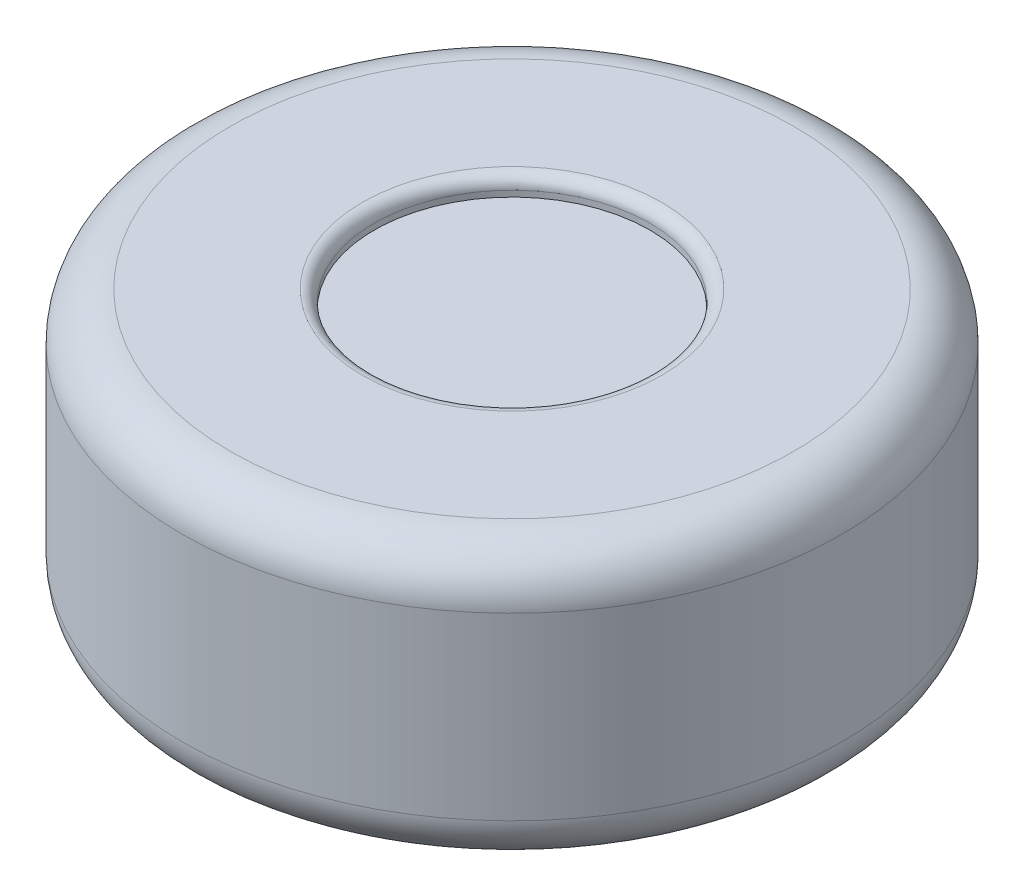
ISO-10303-21;
HEADER;
FILE_DESCRIPTION(('STEP AP214'),'2;1');
FILE_NAME('part.step','',(''),(''),'','','');
FILE_SCHEMA(('AUTOMOTIVE_DESIGN { 1 0 10303 214 1 1 1 1 }'));
ENDSEC;
DATA;
#1=APPLICATION_CONTEXT('core data for automotive mechanical design processes');
#2=APPLICATION_PROTOCOL_DEFINITION('international standard','automotive_design',2000,#1);
#3=PRODUCT_CONTEXT('',#1,'mechanical');
#4=PRODUCT('Part','Part','',(#3));
#5=PRODUCT_RELATED_PRODUCT_CATEGORY('part','',(#4));
#6=PRODUCT_DEFINITION_FORMATION('','',#4);
#7=PRODUCT_DEFINITION_CONTEXT('part definition',#1,'design');
#8=PRODUCT_DEFINITION('design','',#6,#7);
#9=PRODUCT_DEFINITION_SHAPE('','',#8);
#10=(LENGTH_UNIT() NAMED_UNIT(*) SI_UNIT(.MILLI.,.METRE.));
#11=(NAMED_UNIT(*) PLANE_ANGLE_UNIT() SI_UNIT($,.RADIAN.));
#12=(NAMED_UNIT(*) SI_UNIT($,.STERADIAN.) SOLID_ANGLE_UNIT());
#13=UNCERTAINTY_MEASURE_WITH_UNIT(LENGTH_MEASURE(1.E-05),#10,'distance_accuracy_value','');
#14=(GEOMETRIC_REPRESENTATION_CONTEXT(3) GLOBAL_UNCERTAINTY_ASSIGNED_CONTEXT((#13)) GLOBAL_UNIT_ASSIGNED_CONTEXT((#10,
#11,#12)) REPRESENTATION_CONTEXT('',''));
#15=CARTESIAN_POINT('',(0.,0.,0.));
#16=DIRECTION('',(0.,0.,1.));
#17=DIRECTION('',(1.,0.,0.));
#18=AXIS2_PLACEMENT_3D('',#15,#16,#17);
#19=CARTESIAN_POINT('',(0.,-115.,0.));
#20=DIRECTION('',(0.,1.,0.));
#21=DIRECTION('',(0.,0.,1.));
#22=AXIS2_PLACEMENT_3D('',#19,#20,#21);
#23=CYLINDRICAL_SURFACE('',#22,115.);
#24=CARTESIAN_POINT('',(0.,-105.,0.));
#25=DIRECTION('',(0.,1.,0.));
#26=DIRECTION('',(0.,0.,1.));
#27=AXIS2_PLACEMENT_3D('',#24,#25,#26);
#28=CIRCLE('',#27,115.);
#29=CARTESIAN_POINT('',(0.,-105.,115.));
#30=VERTEX_POINT('',#29);
#31=EDGE_CURVE('E42',#30,#30,#28,.F.);
#32=ORIENTED_EDGE('',*,*,#31,.T.);
#33=EDGE_LOOP('',(#32));
#34=FACE_BOUND('',#33,.T.);
#35=CARTESIAN_POINT('',(0.,-100.,0.));
#36=DIRECTION('',(0.,1.,0.));
#37=DIRECTION('',(0.,0.,1.));
#38=AXIS2_PLACEMENT_3D('',#35,#36,#37);
#39=CIRCLE('',#38,115.);
#40=CARTESIAN_POINT('',(0.,-100.,115.));
#41=VERTEX_POINT('',#40);
#42=EDGE_CURVE('E63',#41,#41,#39,.T.);
#43=ORIENTED_EDGE('',*,*,#42,.T.);
#44=EDGE_LOOP('',(#43));
#45=FACE_BOUND('',#44,.T.);
#46=ADVANCED_FACE('F31',(#34,#45),#23,.F.);
#47=CARTESIAN_POINT('',(0.,-115.,0.));
#48=DIRECTION('',(0.,1.,0.));
#49=DIRECTION('',(0.,0.,1.));
#50=AXIS2_PLACEMENT_3D('',#47,#48,#49);
#51=CYLINDRICAL_SURFACE('',#50,275.);
#52=CARTESIAN_POINT('',(0.,75.,0.));
#53=DIRECTION('',(0.,1.,0.));
#54=DIRECTION('',(0.,0.,1.));
#55=AXIS2_PLACEMENT_3D('',#52,#53,#54);
#56=CIRCLE('',#55,275.);
#57=CARTESIAN_POINT('',(0.,75.,275.));
#58=VERTEX_POINT('',#57);
#59=EDGE_CURVE('E54',#58,#58,#56,.F.);
#60=ORIENTED_EDGE('',*,*,#59,.T.);
#61=EDGE_LOOP('',(#60));
#62=FACE_BOUND('',#61,.T.);
#63=CARTESIAN_POINT('',(0.,-75.,0.));
#64=DIRECTION('',(0.,1.,0.));
#65=DIRECTION('',(0.,0.,1.));
#66=AXIS2_PLACEMENT_3D('',#63,#64,#65);
#67=CIRCLE('',#66,275.);
#68=CARTESIAN_POINT('',(0.,-75.,275.));
#69=VERTEX_POINT('',#68);
#70=EDGE_CURVE('E57',#69,#69,#67,.T.);
#71=ORIENTED_EDGE('',*,*,#70,.T.);
#72=EDGE_LOOP('',(#71));
#73=FACE_BOUND('',#72,.T.);
#74=ADVANCED_FACE('F87',(#62,#73),#51,.T.);
#75=CARTESIAN_POINT('',(0.,-115.,0.));
#76=DIRECTION('',(0.,1.,0.));
#77=DIRECTION('',(0.,0.,1.));
#78=AXIS2_PLACEMENT_3D('',#75,#76,#77);
#79=PLANE('',#78);
#80=CARTESIAN_POINT('',(0.,-115.,0.));
#81=DIRECTION('',(0.,1.,0.));
#82=DIRECTION('',(0.,0.,1.));
#83=AXIS2_PLACEMENT_3D('',#80,#81,#82);
#84=CIRCLE('',#83,125.);
#85=CARTESIAN_POINT('',(0.,-115.,125.));
#86=VERTEX_POINT('',#85);
#87=EDGE_CURVE('E46',#86,#86,#84,.T.);
#88=ORIENTED_EDGE('',*,*,#87,.T.);
#89=EDGE_LOOP('',(#88));
#90=FACE_BOUND('',#89,.T.);
#91=CARTESIAN_POINT('',(0.,-115.,0.));
#92=DIRECTION('',(0.,1.,0.));
#93=DIRECTION('',(0.,0.,1.));
#94=AXIS2_PLACEMENT_3D('',#91,#92,#93);
#95=CIRCLE('',#94,235.);
#96=CARTESIAN_POINT('',(0.,-115.,235.));
#97=VERTEX_POINT('',#96);
#98=EDGE_CURVE('E51',#97,#97,#95,.F.);
#99=ORIENTED_EDGE('',*,*,#98,.T.);
#100=EDGE_LOOP('',(#99));
#101=FACE_BOUND('',#100,.T.);
#102=ADVANCED_FACE('F94',(#90,#101),#79,.F.);
#103=CARTESIAN_POINT('',(0.,105.,0.));
#104=DIRECTION('',(0.,1.,0.));
#105=DIRECTION('',(0.,0.,1.));
#106=AXIS2_PLACEMENT_3D('',#103,#104,#105);
#107=CIRCLE('',#106,115.);
#108=CARTESIAN_POINT('',(0.,105.,115.));
#109=VERTEX_POINT('',#108);
#110=EDGE_CURVE('E38',#109,#109,#107,.T.);
#111=ORIENTED_EDGE('',*,*,#110,.T.);
#112=EDGE_LOOP('',(#111));
#113=FACE_BOUND('',#112,.T.);
#114=CARTESIAN_POINT('',(0.,100.,0.));
#115=DIRECTION('',(0.,1.,0.));
#116=DIRECTION('',(0.,0.,1.));
#117=AXIS2_PLACEMENT_3D('',#114,#115,#116);
#118=CIRCLE('',#117,115.);
#119=CARTESIAN_POINT('',(0.,100.,115.));
#120=VERTEX_POINT('',#119);
#121=EDGE_CURVE('E64',#120,#120,#118,.T.);
#122=ORIENTED_EDGE('',*,*,#121,.F.);
#123=EDGE_LOOP('',(#122));
#124=FACE_BOUND('',#123,.T.);
#125=ADVANCED_FACE('F90',(#113,#124),#23,.F.);
#126=CARTESIAN_POINT('',(0.,115.,0.));
#127=DIRECTION('',(0.,1.,0.));
#128=DIRECTION('',(0.,0.,1.));
#129=AXIS2_PLACEMENT_3D('',#126,#127,#128);
#130=PLANE('',#129);
#131=CARTESIAN_POINT('',(0.,115.,0.));
#132=DIRECTION('',(0.,1.,0.));
#133=DIRECTION('',(0.,0.,1.));
#134=AXIS2_PLACEMENT_3D('',#131,#132,#133);
#135=CIRCLE('',#134,125.);
#136=CARTESIAN_POINT('',(0.,115.,125.));
#137=VERTEX_POINT('',#136);
#138=EDGE_CURVE('E10',#137,#137,#135,.F.);
#139=ORIENTED_EDGE('',*,*,#138,.T.);
#140=EDGE_LOOP('',(#139));
#141=FACE_BOUND('',#140,.T.);
#142=CARTESIAN_POINT('',(0.,115.,0.));
#143=DIRECTION('',(0.,1.,0.));
#144=DIRECTION('',(0.,0.,1.));
#145=AXIS2_PLACEMENT_3D('',#142,#143,#144);
#146=CIRCLE('',#145,235.);
#147=CARTESIAN_POINT('',(0.,115.,235.));
#148=VERTEX_POINT('',#147);
#149=EDGE_CURVE('E60',#148,#148,#146,.T.);
#150=ORIENTED_EDGE('',*,*,#149,.T.);
#151=EDGE_LOOP('',(#150));
#152=FACE_BOUND('',#151,.T.);
#153=ADVANCED_FACE('F83',(#141,#152),#130,.T.);
#154=CARTESIAN_POINT('',(0.,100.,0.));
#155=DIRECTION('',(0.,1.,0.));
#156=DIRECTION('',(0.,0.,1.));
#157=AXIS2_PLACEMENT_3D('',#154,#155,#156);
#158=PLANE('',#157);
#159=ORIENTED_EDGE('',*,*,#121,.T.);
#160=EDGE_LOOP('',(#159));
#161=FACE_BOUND('',#160,.T.);
#162=ADVANCED_FACE('F74',(#161),#158,.T.);
#163=CARTESIAN_POINT('',(0.,-100.,0.));
#164=DIRECTION('',(0.,1.,0.));
#165=DIRECTION('',(0.,0.,1.));
#166=AXIS2_PLACEMENT_3D('',#163,#164,#165);
#167=PLANE('',#166);
#168=ORIENTED_EDGE('',*,*,#42,.F.);
#169=EDGE_LOOP('',(#168));
#170=FACE_BOUND('',#169,.T.);
#171=ADVANCED_FACE('F71',(#170),#167,.F.);
#172=CARTESIAN_POINT('',(0.,75.,0.));
#173=DIRECTION('',(0.,1.,0.));
#174=DIRECTION('',(0.,0.,1.));
#175=AXIS2_PLACEMENT_3D('',#172,#173,#174);
#176=TOROIDAL_SURFACE('',#175,235.,40.);
#177=ORIENTED_EDGE('',*,*,#59,.F.);
#178=EDGE_LOOP('',(#177));
#179=FACE_BOUND('',#178,.T.);
#180=ORIENTED_EDGE('',*,*,#149,.F.);
#181=EDGE_LOOP('',(#180));
#182=FACE_BOUND('',#181,.T.);
#183=ADVANCED_FACE('F73',(#179,#182),#176,.T.);
#184=CARTESIAN_POINT('',(0.,-75.,0.));
#185=DIRECTION('',(0.,1.,0.));
#186=DIRECTION('',(0.,0.,1.));
#187=AXIS2_PLACEMENT_3D('',#184,#185,#186);
#188=TOROIDAL_SURFACE('',#187,235.,40.);
#189=ORIENTED_EDGE('',*,*,#98,.F.);
#190=EDGE_LOOP('',(#189));
#191=FACE_BOUND('',#190,.T.);
#192=ORIENTED_EDGE('',*,*,#70,.F.);
#193=EDGE_LOOP('',(#192));
#194=FACE_BOUND('',#193,.T.);
#195=ADVANCED_FACE('F80',(#191,#194),#188,.T.);
#196=CARTESIAN_POINT('',(0.,-105.,0.));
#197=DIRECTION('',(0.,1.,0.));
#198=DIRECTION('',(0.,0.,1.));
#199=AXIS2_PLACEMENT_3D('',#196,#197,#198);
#200=TOROIDAL_SURFACE('',#199,125.,10.);
#201=ORIENTED_EDGE('',*,*,#31,.F.);
#202=EDGE_LOOP('',(#201));
#203=FACE_BOUND('',#202,.T.);
#204=ORIENTED_EDGE('',*,*,#87,.F.);
#205=EDGE_LOOP('',(#204));
#206=FACE_BOUND('',#205,.T.);
#207=ADVANCED_FACE('F115',(#203,#206),#200,.T.);
#208=CARTESIAN_POINT('',(0.,105.,0.));
#209=DIRECTION('',(0.,1.,0.));
#210=DIRECTION('',(0.,0.,1.));
#211=AXIS2_PLACEMENT_3D('',#208,#209,#210);
#212=TOROIDAL_SURFACE('',#211,125.,10.);
#213=ORIENTED_EDGE('',*,*,#138,.F.);
#214=EDGE_LOOP('',(#213));
#215=FACE_BOUND('',#214,.T.);
#216=ORIENTED_EDGE('',*,*,#110,.F.);
#217=EDGE_LOOP('',(#216));
#218=FACE_BOUND('',#217,.T.);
#219=ADVANCED_FACE('F33',(#215,#218),#212,.T.);
#220=CLOSED_SHELL('',(#46,#74,#102,#125,#153,#162,#171,#183,#195,#207,#219));
#221=MANIFOLD_SOLID_BREP('B2',#220);
#222=ADVANCED_BREP_SHAPE_REPRESENTATION('',(#18,#221),#14);
#223=SHAPE_DEFINITION_REPRESENTATION(#9,#222);
ENDSEC;
END-ISO-10303-21;
